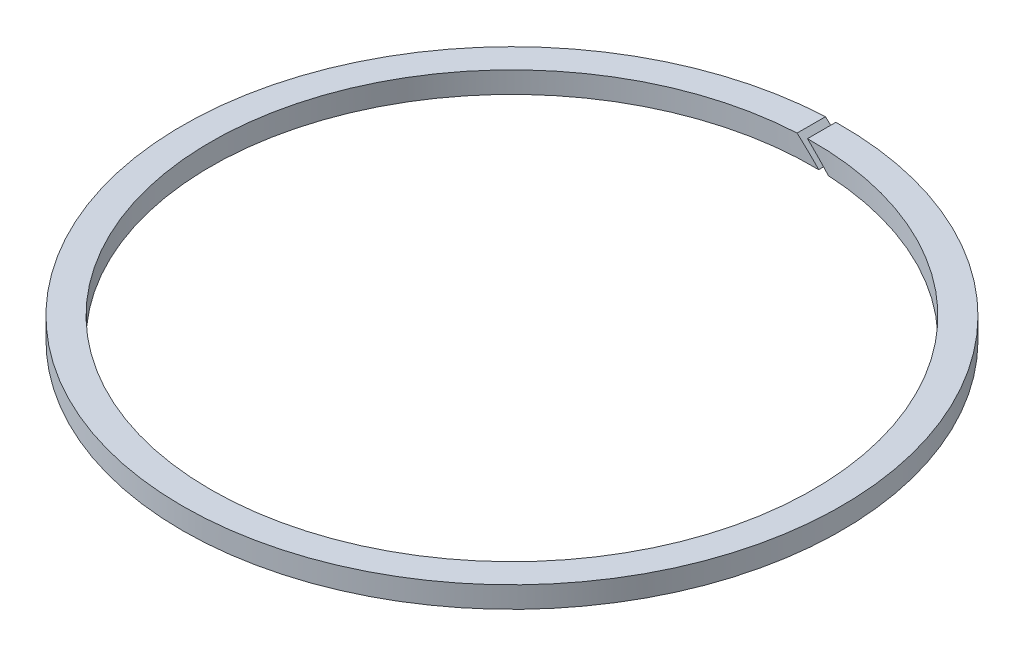
ISO-10303-21;
HEADER;
FILE_DESCRIPTION(('STEP AP214'),'2;1');
FILE_NAME('part.step','',(''),(''),'','','');
FILE_SCHEMA(('AUTOMOTIVE_DESIGN { 1 0 10303 214 1 1 1 1 }'));
ENDSEC;
DATA;
#1=APPLICATION_CONTEXT('core data for automotive mechanical design processes');
#2=APPLICATION_PROTOCOL_DEFINITION('international standard','automotive_design',2000,#1);
#3=PRODUCT_CONTEXT('',#1,'mechanical');
#4=PRODUCT('Part','Part','',(#3));
#5=PRODUCT_RELATED_PRODUCT_CATEGORY('part','',(#4));
#6=PRODUCT_DEFINITION_FORMATION('','',#4);
#7=PRODUCT_DEFINITION_CONTEXT('part definition',#1,'design');
#8=PRODUCT_DEFINITION('design','',#6,#7);
#9=PRODUCT_DEFINITION_SHAPE('','',#8);
#10=(LENGTH_UNIT() NAMED_UNIT(*) SI_UNIT(.MILLI.,.METRE.));
#11=(NAMED_UNIT(*) PLANE_ANGLE_UNIT() SI_UNIT($,.RADIAN.));
#12=(NAMED_UNIT(*) SI_UNIT($,.STERADIAN.) SOLID_ANGLE_UNIT());
#13=UNCERTAINTY_MEASURE_WITH_UNIT(LENGTH_MEASURE(1.E-05),#10,'distance_accuracy_value','');
#14=(GEOMETRIC_REPRESENTATION_CONTEXT(3) GLOBAL_UNCERTAINTY_ASSIGNED_CONTEXT((#13)) GLOBAL_UNIT_ASSIGNED_CONTEXT((#10,
#11,#12)) REPRESENTATION_CONTEXT('',''));
#15=CARTESIAN_POINT('',(0.,0.,0.));
#16=DIRECTION('',(0.,0.,1.));
#17=DIRECTION('',(1.,0.,0.));
#18=AXIS2_PLACEMENT_3D('',#15,#16,#17);
#19=CARTESIAN_POINT('',(0.,1.5,0.));
#20=DIRECTION('',(0.,1.,0.));
#21=DIRECTION('',(0.,0.,1.));
#22=AXIS2_PLACEMENT_3D('',#19,#20,#21);
#23=PLANE('',#22);
#24=DIRECTION('',(0.,0.,-1.));
#25=VECTOR('',#24,1.);
#26=CARTESIAN_POINT('',(-2.20710678118655,1.5,-46.501));
#27=LINE('',#26,#25);
#28=CARTESIAN_POINT('',(-2.20710678118655,1.5,-42.4426516567526));
#29=VERTEX_POINT('',#28);
#30=CARTESIAN_POINT('',(-2.20710678118655,1.5,-46.4475906765511));
#31=VERTEX_POINT('',#30);
#32=EDGE_CURVE('E56',#29,#31,#27,.T.);
#33=ORIENTED_EDGE('',*,*,#32,.T.);
#34=CARTESIAN_POINT('',(0.,1.5,0.));
#35=DIRECTION('',(0.,1.,0.));
#36=DIRECTION('',(0.,0.,1.));
#37=AXIS2_PLACEMENT_3D('',#34,#35,#36);
#38=CIRCLE('',#37,46.5);
#39=CARTESIAN_POINT('',(-0.792893218813455,1.5,-46.4932395122512));
#40=VERTEX_POINT('',#39);
#41=EDGE_CURVE('E11',#31,#40,#38,.T.);
#42=ORIENTED_EDGE('',*,*,#41,.T.);
#43=DIRECTION('',(0.,0.,1.));
#44=VECTOR('',#43,1.);
#45=CARTESIAN_POINT('',(-0.792893218813455,1.5,-46.501));
#46=LINE('',#45,#44);
#47=CARTESIAN_POINT('',(-0.792893218813455,1.5,-42.4926031250565));
#48=VERTEX_POINT('',#47);
#49=EDGE_CURVE('E74',#40,#48,#46,.T.);
#50=ORIENTED_EDGE('',*,*,#49,.T.);
#51=CARTESIAN_POINT('',(0.,1.5,0.));
#52=DIRECTION('',(0.,1.,0.));
#53=DIRECTION('',(0.,0.,1.));
#54=AXIS2_PLACEMENT_3D('',#51,#52,#53);
#55=CIRCLE('',#54,42.5);
#56=EDGE_CURVE('E84',#29,#48,#55,.T.);
#57=ORIENTED_EDGE('',*,*,#56,.F.);
#58=EDGE_LOOP('',(#33,#42,#50,#57));
#59=FACE_BOUND('',#58,.T.);
#60=ADVANCED_FACE('F33',(#59),#23,.T.);
#61=CARTESIAN_POINT('',(0.,-1.5,0.));
#62=DIRECTION('',(0.,1.,0.));
#63=DIRECTION('',(0.,0.,1.));
#64=AXIS2_PLACEMENT_3D('',#61,#62,#63);
#65=PLANE('',#64);
#66=CARTESIAN_POINT('',(0.,-1.5,0.));
#67=DIRECTION('',(0.,1.,0.));
#68=DIRECTION('',(0.,0.,1.));
#69=AXIS2_PLACEMENT_3D('',#66,#67,#68);
#70=CIRCLE('',#69,46.5);
#71=CARTESIAN_POINT('',(0.792893218813453,-1.5,-46.4932395122512));
#72=VERTEX_POINT('',#71);
#73=CARTESIAN_POINT('',(2.20710678118655,-1.5,-46.4475906765511));
#74=VERTEX_POINT('',#73);
#75=EDGE_CURVE('E37',#72,#74,#70,.T.);
#76=ORIENTED_EDGE('',*,*,#75,.F.);
#77=DIRECTION('',(0.,0.,-1.));
#78=VECTOR('',#77,1.);
#79=CARTESIAN_POINT('',(0.792893218813451,-1.5,-46.501));
#80=LINE('',#79,#78);
#81=CARTESIAN_POINT('',(0.792893218813453,-1.5,-42.4926031250565));
#82=VERTEX_POINT('',#81);
#83=EDGE_CURVE('E97',#82,#72,#80,.T.);
#84=ORIENTED_EDGE('',*,*,#83,.F.);
#85=CARTESIAN_POINT('',(0.,-1.5,0.));
#86=DIRECTION('',(0.,1.,0.));
#87=DIRECTION('',(0.,0.,1.));
#88=AXIS2_PLACEMENT_3D('',#85,#86,#87);
#89=CIRCLE('',#88,42.5);
#90=CARTESIAN_POINT('',(2.20710678118655,-1.5,-42.4426516567526));
#91=VERTEX_POINT('',#90);
#92=EDGE_CURVE('E89',#82,#91,#89,.T.);
#93=ORIENTED_EDGE('',*,*,#92,.T.);
#94=DIRECTION('',(0.,0.,1.));
#95=VECTOR('',#94,1.);
#96=CARTESIAN_POINT('',(2.20710678118655,-1.5,-46.501));
#97=LINE('',#96,#95);
#98=EDGE_CURVE('E48',#74,#91,#97,.T.);
#99=ORIENTED_EDGE('',*,*,#98,.F.);
#100=EDGE_LOOP('',(#76,#84,#93,#99));
#101=FACE_BOUND('',#100,.T.);
#102=ADVANCED_FACE('F104',(#101),#65,.F.);
#103=CARTESIAN_POINT('',(0.,1.5,0.));
#104=DIRECTION('',(0.,-1.,0.));
#105=DIRECTION('',(0.,0.,-1.));
#106=AXIS2_PLACEMENT_3D('',#103,#104,#105);
#107=CYLINDRICAL_SURFACE('',#106,46.5);
#108=ORIENTED_EDGE('',*,*,#41,.F.);
#109=CARTESIAN_POINT('',(0.,-0.707106781186547,0.));
#110=DIRECTION('',(-0.707106781186547,-0.707106781186548,0.));
#111=DIRECTION('',(0.707106781186548,-0.707106781186547,0.));
#112=AXIS2_PLACEMENT_3D('',#109,#110,#111);
#113=ELLIPSE('',#112,65.7609306503489,46.5);
#114=EDGE_CURVE('E92',#72,#31,#113,.F.);
#115=ORIENTED_EDGE('',*,*,#114,.F.);
#116=ORIENTED_EDGE('',*,*,#75,.T.);
#117=CARTESIAN_POINT('',(0.,0.707106781186546,0.));
#118=DIRECTION('',(0.707106781186547,0.707106781186548,0.));
#119=DIRECTION('',(0.707106781186548,-0.707106781186547,0.));
#120=AXIS2_PLACEMENT_3D('',#117,#118,#119);
#121=ELLIPSE('',#120,65.7609306503489,46.5);
#122=EDGE_CURVE('E80',#40,#74,#121,.F.);
#123=ORIENTED_EDGE('',*,*,#122,.F.);
#124=EDGE_LOOP('',(#108,#115,#116,#123));
#125=FACE_BOUND('',#124,.T.);
#126=ADVANCED_FACE('F35',(#125),#107,.T.);
#127=CARTESIAN_POINT('',(0.,1.5,0.));
#128=DIRECTION('',(0.,-1.,0.));
#129=DIRECTION('',(0.,0.,-1.));
#130=AXIS2_PLACEMENT_3D('',#127,#128,#129);
#131=CYLINDRICAL_SURFACE('',#130,42.5);
#132=CARTESIAN_POINT('',(0.,-0.707106781186547,0.));
#133=DIRECTION('',(-0.707106781186547,-0.707106781186548,0.));
#134=DIRECTION('',(0.707106781186548,-0.707106781186547,0.));
#135=AXIS2_PLACEMENT_3D('',#132,#133,#134);
#136=ELLIPSE('',#135,60.1040764008565,42.5);
#137=EDGE_CURVE('E86',#82,#29,#136,.F.);
#138=ORIENTED_EDGE('',*,*,#137,.T.);
#139=ORIENTED_EDGE('',*,*,#56,.T.);
#140=CARTESIAN_POINT('',(0.,0.707106781186546,0.));
#141=DIRECTION('',(0.707106781186547,0.707106781186548,0.));
#142=DIRECTION('',(0.707106781186548,-0.707106781186547,0.));
#143=AXIS2_PLACEMENT_3D('',#140,#141,#142);
#144=ELLIPSE('',#143,60.1040764008565,42.5);
#145=EDGE_CURVE('E71',#48,#91,#144,.F.);
#146=ORIENTED_EDGE('',*,*,#145,.T.);
#147=ORIENTED_EDGE('',*,*,#92,.F.);
#148=EDGE_LOOP('',(#138,#139,#146,#147));
#149=FACE_BOUND('',#148,.T.);
#150=ADVANCED_FACE('F88',(#149),#131,.F.);
#151=CARTESIAN_POINT('',(-5.44921616655425,6.1563229477408,-46.501));
#152=DIRECTION('',(0.707106781186547,0.707106781186548,0.));
#153=DIRECTION('',(-0.707106781186548,0.707106781186547,0.));
#154=AXIS2_PLACEMENT_3D('',#151,#152,#153);
#155=PLANE('',#154);
#156=ORIENTED_EDGE('',*,*,#122,.T.);
#157=ORIENTED_EDGE('',*,*,#98,.T.);
#158=ORIENTED_EDGE('',*,*,#145,.F.);
#159=ORIENTED_EDGE('',*,*,#49,.F.);
#160=EDGE_LOOP('',(#156,#157,#158,#159));
#161=FACE_BOUND('',#160,.T.);
#162=ADVANCED_FACE('F73',(#161),#155,.F.);
#163=CARTESIAN_POINT('',(-6.1563229477408,5.44921616655425,-46.501));
#164=DIRECTION('',(-0.707106781186547,-0.707106781186548,0.));
#165=DIRECTION('',(0.707106781186548,-0.707106781186547,0.));
#166=AXIS2_PLACEMENT_3D('',#163,#164,#165);
#167=PLANE('',#166);
#168=ORIENTED_EDGE('',*,*,#114,.T.);
#169=ORIENTED_EDGE('',*,*,#32,.F.);
#170=ORIENTED_EDGE('',*,*,#137,.F.);
#171=ORIENTED_EDGE('',*,*,#83,.T.);
#172=EDGE_LOOP('',(#168,#169,#170,#171));
#173=FACE_BOUND('',#172,.T.);
#174=ADVANCED_FACE('F107',(#173),#167,.F.);
#175=CLOSED_SHELL('',(#60,#102,#126,#150,#162,#174));
#176=MANIFOLD_SOLID_BREP('B2',#175);
#177=ADVANCED_BREP_SHAPE_REPRESENTATION('',(#18,#176),#14);
#178=SHAPE_DEFINITION_REPRESENTATION(#9,#177);
ENDSEC;
END-ISO-10303-21;
